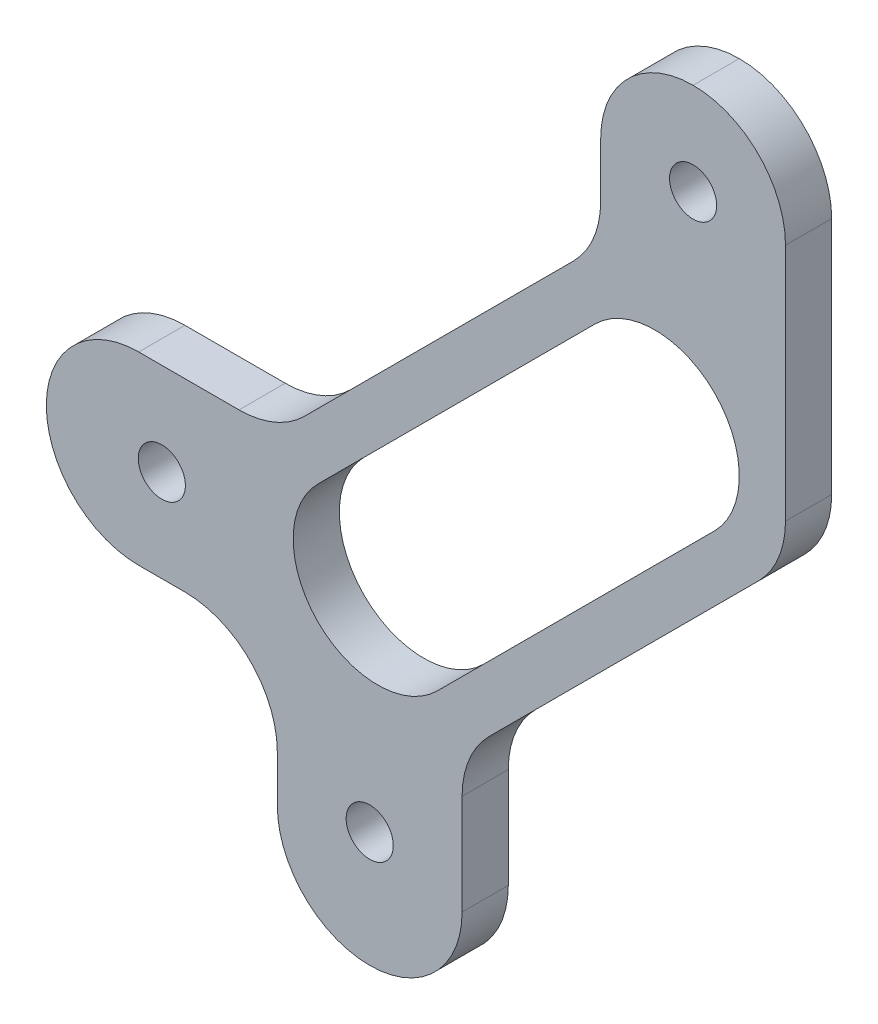
ISO-10303-21;
HEADER;
FILE_DESCRIPTION(('STEP AP214'),'2;1');
FILE_NAME('part.step','',(''),(''),'','','');
FILE_SCHEMA(('AUTOMOTIVE_DESIGN { 1 0 10303 214 1 1 1 1 }'));
ENDSEC;
DATA;
#1=APPLICATION_CONTEXT('core data for automotive mechanical design processes');
#2=APPLICATION_PROTOCOL_DEFINITION('international standard','automotive_design',2000,#1);
#3=PRODUCT_CONTEXT('',#1,'mechanical');
#4=PRODUCT('Part','Part','',(#3));
#5=PRODUCT_RELATED_PRODUCT_CATEGORY('part','',(#4));
#6=PRODUCT_DEFINITION_FORMATION('','',#4);
#7=PRODUCT_DEFINITION_CONTEXT('part definition',#1,'design');
#8=PRODUCT_DEFINITION('design','',#6,#7);
#9=PRODUCT_DEFINITION_SHAPE('','',#8);
#10=(LENGTH_UNIT() NAMED_UNIT(*) SI_UNIT(.MILLI.,.METRE.));
#11=(NAMED_UNIT(*) PLANE_ANGLE_UNIT() SI_UNIT($,.RADIAN.));
#12=(NAMED_UNIT(*) SI_UNIT($,.STERADIAN.) SOLID_ANGLE_UNIT());
#13=UNCERTAINTY_MEASURE_WITH_UNIT(LENGTH_MEASURE(1.E-05),#10,'distance_accuracy_value','');
#14=(GEOMETRIC_REPRESENTATION_CONTEXT(3) GLOBAL_UNCERTAINTY_ASSIGNED_CONTEXT((#13)) GLOBAL_UNIT_ASSIGNED_CONTEXT((#10,
#11,#12)) REPRESENTATION_CONTEXT('',''));
#15=CARTESIAN_POINT('',(0.,0.,0.));
#16=DIRECTION('',(0.,0.,1.));
#17=DIRECTION('',(1.,0.,0.));
#18=AXIS2_PLACEMENT_3D('',#15,#16,#17);
#19=CARTESIAN_POINT('',(0.,0.,5.));
#20=DIRECTION('',(0.,0.,-1.));
#21=DIRECTION('',(-1.,0.,0.));
#22=AXIS2_PLACEMENT_3D('',#19,#20,#21);
#23=PLANE('',#22);
#24=DIRECTION('',(0.707106781186547,0.707106781186547,0.));
#25=VECTOR('',#24,1.);
#26=CARTESIAN_POINT('',(47.3223304703363,34.3933982822018,5.));
#27=LINE('',#26,#25);
#28=CARTESIAN_POINT('',(17.3223304703363,4.39339828220181,5.));
#29=VERTEX_POINT('',#28);
#30=CARTESIAN_POINT('',(47.3223304703363,34.3933982822018,5.));
#31=VERTEX_POINT('',#30);
#32=EDGE_CURVE('E230',#29,#31,#27,.T.);
#33=ORIENTED_EDGE('',*,*,#32,.F.);
#34=CARTESIAN_POINT('',(10.8578643762691,10.8578643762691,5.));
#35=DIRECTION('',(0.,0.,1.));
#36=DIRECTION('',(1.,0.,0.));
#37=AXIS2_PLACEMENT_3D('',#34,#35,#36);
#38=CIRCLE('',#37,9.14213562373093);
#39=CARTESIAN_POINT('',(4.39339828220181,17.3223304703363,5.));
#40=VERTEX_POINT('',#39);
#41=EDGE_CURVE('E57',#40,#29,#38,.T.);
#42=ORIENTED_EDGE('',*,*,#41,.F.);
#43=DIRECTION('',(-0.707106781186547,-0.707106781186548,0.));
#44=VECTOR('',#43,1.);
#45=CARTESIAN_POINT('',(4.39339828220181,17.3223304703363,5.));
#46=LINE('',#45,#44);
#47=CARTESIAN_POINT('',(34.3933982822018,47.3223304703363,5.));
#48=VERTEX_POINT('',#47);
#49=EDGE_CURVE('E217',#48,#40,#46,.T.);
#50=ORIENTED_EDGE('',*,*,#49,.F.);
#51=CARTESIAN_POINT('',(40.8578643762691,40.8578643762691,5.));
#52=DIRECTION('',(0.,0.,1.));
#53=DIRECTION('',(1.,0.,0.));
#54=AXIS2_PLACEMENT_3D('',#51,#52,#53);
#55=CIRCLE('',#54,9.14213562373094);
#56=EDGE_CURVE('E221',#31,#48,#55,.T.);
#57=ORIENTED_EDGE('',*,*,#56,.F.);
#58=EDGE_LOOP('',(#33,#42,#50,#57));
#59=FACE_BOUND('',#58,.T.);
#60=CARTESIAN_POINT('',(45.,65.,5.));
#61=DIRECTION('',(0.,0.,-1.));
#62=DIRECTION('',(-1.,0.,0.));
#63=AXIS2_PLACEMENT_3D('',#60,#61,#62);
#64=CIRCLE('',#63,10.);
#65=CARTESIAN_POINT('',(55.,65.,5.));
#66=VERTEX_POINT('',#65);
#67=CARTESIAN_POINT('',(45.,75.,5.));
#68=VERTEX_POINT('',#67);
#69=EDGE_CURVE('E376',#66,#68,#64,.F.);
#70=ORIENTED_EDGE('',*,*,#69,.T.);
#71=CARTESIAN_POINT('',(45.,65.,5.));
#72=DIRECTION('',(0.,0.,-1.));
#73=DIRECTION('',(-1.,0.,0.));
#74=AXIS2_PLACEMENT_3D('',#71,#72,#73);
#75=CIRCLE('',#74,10.);
#76=CARTESIAN_POINT('',(35.,65.,5.));
#77=VERTEX_POINT('',#76);
#78=EDGE_CURVE('E379',#68,#77,#75,.F.);
#79=ORIENTED_EDGE('',*,*,#78,.T.);
#80=DIRECTION('',(0.,-1.,0.));
#81=VECTOR('',#80,1.);
#82=CARTESIAN_POINT('',(35.,55.,5.));
#83=LINE('',#82,#81);
#84=CARTESIAN_POINT('',(35.,59.1421356237309,5.));
#85=VERTEX_POINT('',#84);
#86=EDGE_CURVE('E283',#77,#85,#83,.T.);
#87=ORIENTED_EDGE('',*,*,#86,.T.);
#88=CARTESIAN_POINT('',(25.,59.1421356237309,5.));
#89=DIRECTION('',(0.,0.,-1.));
#90=DIRECTION('',(-1.,0.,0.));
#91=AXIS2_PLACEMENT_3D('',#88,#89,#90);
#92=CIRCLE('',#91,10.);
#93=CARTESIAN_POINT('',(32.0710678118655,52.0710678118655,5.));
#94=VERTEX_POINT('',#93);
#95=EDGE_CURVE('E11',#85,#94,#92,.T.);
#96=ORIENTED_EDGE('',*,*,#95,.T.);
#97=DIRECTION('',(-0.707106781186546,-0.707106781186549,0.));
#98=VECTOR('',#97,1.);
#99=CARTESIAN_POINT('',(1.56125112837913E-13,20.,5.));
#100=LINE('',#99,#98);
#101=CARTESIAN_POINT('',(2.92893218813469,22.9289321881345,5.));
#102=VERTEX_POINT('',#101);
#103=EDGE_CURVE('E287',#94,#102,#100,.T.);
#104=ORIENTED_EDGE('',*,*,#103,.T.);
#105=CARTESIAN_POINT('',(-4.1421356237308,30.,5.));
#106=DIRECTION('',(0.,0.,-1.));
#107=DIRECTION('',(-1.,0.,0.));
#108=AXIS2_PLACEMENT_3D('',#105,#106,#107);
#109=CIRCLE('',#108,10.);
#110=CARTESIAN_POINT('',(-4.1421356237308,20.,5.));
#111=VERTEX_POINT('',#110);
#112=EDGE_CURVE('E446',#102,#111,#109,.T.);
#113=ORIENTED_EDGE('',*,*,#112,.T.);
#114=DIRECTION('',(-1.,0.,0.));
#115=VECTOR('',#114,1.);
#116=CARTESIAN_POINT('',(-25.,20.,5.));
#117=LINE('',#116,#115);
#118=CARTESIAN_POINT('',(-15.,20.,5.));
#119=VERTEX_POINT('',#118);
#120=EDGE_CURVE('E291',#111,#119,#117,.T.);
#121=ORIENTED_EDGE('',*,*,#120,.T.);
#122=CARTESIAN_POINT('',(-15.,10.,5.));
#123=DIRECTION('',(0.,0.,-1.));
#124=DIRECTION('',(-1.,0.,0.));
#125=AXIS2_PLACEMENT_3D('',#122,#123,#124);
#126=CIRCLE('',#125,10.);
#127=CARTESIAN_POINT('',(-25.,10.,5.));
#128=VERTEX_POINT('',#127);
#129=EDGE_CURVE('E364',#119,#128,#126,.F.);
#130=ORIENTED_EDGE('',*,*,#129,.T.);
#131=CARTESIAN_POINT('',(-15.,10.,5.));
#132=DIRECTION('',(0.,0.,-1.));
#133=DIRECTION('',(-1.,0.,0.));
#134=AXIS2_PLACEMENT_3D('',#131,#132,#133);
#135=CIRCLE('',#134,10.);
#136=CARTESIAN_POINT('',(-15.,0.,5.));
#137=VERTEX_POINT('',#136);
#138=EDGE_CURVE('E367',#128,#137,#135,.F.);
#139=ORIENTED_EDGE('',*,*,#138,.T.);
#140=DIRECTION('',(1.,0.,0.));
#141=VECTOR('',#140,1.);
#142=CARTESIAN_POINT('',(0.,0.,5.));
#143=LINE('',#142,#141);
#144=CARTESIAN_POINT('',(-10.,0.,5.));
#145=VERTEX_POINT('',#144);
#146=EDGE_CURVE('E295',#137,#145,#143,.T.);
#147=ORIENTED_EDGE('',*,*,#146,.T.);
#148=CARTESIAN_POINT('',(-10.,-10.,5.));
#149=DIRECTION('',(0.,0.,-1.));
#150=DIRECTION('',(-1.,0.,0.));
#151=AXIS2_PLACEMENT_3D('',#148,#149,#150);
#152=CIRCLE('',#151,10.);
#153=CARTESIAN_POINT('',(0.,-10.,5.));
#154=VERTEX_POINT('',#153);
#155=EDGE_CURVE('E440',#145,#154,#152,.T.);
#156=ORIENTED_EDGE('',*,*,#155,.T.);
#157=DIRECTION('',(0.,-1.,0.));
#158=VECTOR('',#157,1.);
#159=CARTESIAN_POINT('',(0.,-25.,5.));
#160=LINE('',#159,#158);
#161=CARTESIAN_POINT('',(0.,-15.,5.));
#162=VERTEX_POINT('',#161);
#163=EDGE_CURVE('E299',#154,#162,#160,.T.);
#164=ORIENTED_EDGE('',*,*,#163,.T.);
#165=CARTESIAN_POINT('',(10.,-15.,5.));
#166=DIRECTION('',(0.,0.,-1.));
#167=DIRECTION('',(-1.,0.,0.));
#168=AXIS2_PLACEMENT_3D('',#165,#166,#167);
#169=CIRCLE('',#168,10.);
#170=CARTESIAN_POINT('',(10.,-25.,5.));
#171=VERTEX_POINT('',#170);
#172=EDGE_CURVE('E370',#162,#171,#169,.F.);
#173=ORIENTED_EDGE('',*,*,#172,.T.);
#174=CARTESIAN_POINT('',(10.,-15.,5.));
#175=DIRECTION('',(0.,0.,-1.));
#176=DIRECTION('',(-1.,0.,0.));
#177=AXIS2_PLACEMENT_3D('',#174,#175,#176);
#178=CIRCLE('',#177,10.);
#179=CARTESIAN_POINT('',(20.,-15.,5.));
#180=VERTEX_POINT('',#179);
#181=EDGE_CURVE('E373',#171,#180,#178,.F.);
#182=ORIENTED_EDGE('',*,*,#181,.T.);
#183=DIRECTION('',(0.,1.,0.));
#184=VECTOR('',#183,1.);
#185=CARTESIAN_POINT('',(20.,0.,5.));
#186=LINE('',#185,#184);
#187=CARTESIAN_POINT('',(20.,-4.14213562373095,5.));
#188=VERTEX_POINT('',#187);
#189=EDGE_CURVE('E270',#180,#188,#186,.T.);
#190=ORIENTED_EDGE('',*,*,#189,.T.);
#191=CARTESIAN_POINT('',(30.,-4.14213562373094,5.));
#192=DIRECTION('',(0.,0.,-1.));
#193=DIRECTION('',(-1.,0.,0.));
#194=AXIS2_PLACEMENT_3D('',#191,#192,#193);
#195=CIRCLE('',#194,10.);
#196=CARTESIAN_POINT('',(22.9289321881345,2.92893218813452,5.));
#197=VERTEX_POINT('',#196);
#198=EDGE_CURVE('E434',#188,#197,#195,.T.);
#199=ORIENTED_EDGE('',*,*,#198,.T.);
#200=DIRECTION('',(0.707106781186546,0.707106781186549,0.));
#201=VECTOR('',#200,1.);
#202=CARTESIAN_POINT('',(55.,35.0000000000002,5.));
#203=LINE('',#202,#201);
#204=CARTESIAN_POINT('',(52.0710678118655,32.0710678118656,5.));
#205=VERTEX_POINT('',#204);
#206=EDGE_CURVE('E274',#197,#205,#203,.T.);
#207=ORIENTED_EDGE('',*,*,#206,.T.);
#208=CARTESIAN_POINT('',(45.,39.1421356237311,5.));
#209=DIRECTION('',(0.,0.,-1.));
#210=DIRECTION('',(-1.,0.,0.));
#211=AXIS2_PLACEMENT_3D('',#208,#209,#210);
#212=CIRCLE('',#211,10.);
#213=CARTESIAN_POINT('',(55.,39.1421356237311,5.));
#214=VERTEX_POINT('',#213);
#215=EDGE_CURVE('E361',#205,#214,#212,.F.);
#216=ORIENTED_EDGE('',*,*,#215,.T.);
#217=DIRECTION('',(0.,1.,0.));
#218=VECTOR('',#217,1.);
#219=CARTESIAN_POINT('',(55.,75.,5.));
#220=LINE('',#219,#218);
#221=EDGE_CURVE('E279',#214,#66,#220,.T.);
#222=ORIENTED_EDGE('',*,*,#221,.T.);
#223=EDGE_LOOP('',(#70,#79,#87,#96,#104,#113,#121,#130,#139,#147,#156,#164,#173,#182,#190,#199,
#207,#216,#222));
#224=FACE_BOUND('',#223,.T.);
#225=CARTESIAN_POINT('',(-12.5,10.,5.));
#226=DIRECTION('',(0.,0.,1.));
#227=DIRECTION('',(1.,0.,0.));
#228=AXIS2_PLACEMENT_3D('',#225,#226,#227);
#229=CIRCLE('',#228,2.55);
#230=CARTESIAN_POINT('',(-9.95,10.,5.));
#231=VERTEX_POINT('',#230);
#232=EDGE_CURVE('E262',#231,#231,#229,.T.);
#233=ORIENTED_EDGE('',*,*,#232,.F.);
#234=EDGE_LOOP('',(#233));
#235=FACE_BOUND('',#234,.T.);
#236=CARTESIAN_POINT('',(10.,-12.5,5.));
#237=DIRECTION('',(0.,0.,1.));
#238=DIRECTION('',(1.,0.,0.));
#239=AXIS2_PLACEMENT_3D('',#236,#237,#238);
#240=CIRCLE('',#239,2.55);
#241=CARTESIAN_POINT('',(12.55,-12.5,5.));
#242=VERTEX_POINT('',#241);
#243=EDGE_CURVE('E254',#242,#242,#240,.T.);
#244=ORIENTED_EDGE('',*,*,#243,.F.);
#245=EDGE_LOOP('',(#244));
#246=FACE_BOUND('',#245,.T.);
#247=CARTESIAN_POINT('',(45.,65.,5.));
#248=DIRECTION('',(0.,0.,1.));
#249=DIRECTION('',(1.,0.,0.));
#250=AXIS2_PLACEMENT_3D('',#247,#248,#249);
#251=CIRCLE('',#250,2.55);
#252=CARTESIAN_POINT('',(47.55,65.,5.));
#253=VERTEX_POINT('',#252);
#254=EDGE_CURVE('E244',#253,#253,#251,.T.);
#255=ORIENTED_EDGE('',*,*,#254,.F.);
#256=EDGE_LOOP('',(#255));
#257=FACE_BOUND('',#256,.T.);
#258=ADVANCED_FACE('F39',(#59,#224,#235,#246,#257),#23,.F.);
#259=CARTESIAN_POINT('',(0.,0.,0.));
#260=DIRECTION('',(0.,0.,-1.));
#261=DIRECTION('',(-1.,0.,0.));
#262=AXIS2_PLACEMENT_3D('',#259,#260,#261);
#263=PLANE('',#262);
#264=CARTESIAN_POINT('',(10.8578643762691,10.8578643762691,0.));
#265=DIRECTION('',(0.,0.,1.));
#266=DIRECTION('',(1.,0.,0.));
#267=AXIS2_PLACEMENT_3D('',#264,#265,#266);
#268=CIRCLE('',#267,9.14213562373093);
#269=CARTESIAN_POINT('',(4.39339828220181,17.3223304703363,0.));
#270=VERTEX_POINT('',#269);
#271=CARTESIAN_POINT('',(17.3223304703363,4.39339828220181,0.));
#272=VERTEX_POINT('',#271);
#273=EDGE_CURVE('E198',#270,#272,#268,.T.);
#274=ORIENTED_EDGE('',*,*,#273,.T.);
#275=DIRECTION('',(0.707106781186547,0.707106781186547,0.));
#276=VECTOR('',#275,1.);
#277=CARTESIAN_POINT('',(47.3223304703363,34.3933982822018,0.));
#278=LINE('',#277,#276);
#279=CARTESIAN_POINT('',(47.3223304703363,34.3933982822018,0.));
#280=VERTEX_POINT('',#279);
#281=EDGE_CURVE('E208',#272,#280,#278,.T.);
#282=ORIENTED_EDGE('',*,*,#281,.T.);
#283=CARTESIAN_POINT('',(40.8578643762691,40.8578643762691,0.));
#284=DIRECTION('',(0.,0.,1.));
#285=DIRECTION('',(1.,0.,0.));
#286=AXIS2_PLACEMENT_3D('',#283,#284,#285);
#287=CIRCLE('',#286,9.14213562373094);
#288=CARTESIAN_POINT('',(34.3933982822018,47.3223304703363,0.));
#289=VERTEX_POINT('',#288);
#290=EDGE_CURVE('E65',#280,#289,#287,.T.);
#291=ORIENTED_EDGE('',*,*,#290,.T.);
#292=DIRECTION('',(-0.707106781186547,-0.707106781186548,0.));
#293=VECTOR('',#292,1.);
#294=CARTESIAN_POINT('',(4.39339828220181,17.3223304703363,0.));
#295=LINE('',#294,#293);
#296=EDGE_CURVE('E205',#289,#270,#295,.T.);
#297=ORIENTED_EDGE('',*,*,#296,.T.);
#298=EDGE_LOOP('',(#274,#282,#291,#297));
#299=FACE_BOUND('',#298,.T.);
#300=CARTESIAN_POINT('',(10.,-12.5,0.));
#301=DIRECTION('',(0.,0.,1.));
#302=DIRECTION('',(1.,0.,0.));
#303=AXIS2_PLACEMENT_3D('',#300,#301,#302);
#304=CIRCLE('',#303,2.55);
#305=CARTESIAN_POINT('',(12.55,-12.5,0.));
#306=VERTEX_POINT('',#305);
#307=EDGE_CURVE('E248',#306,#306,#304,.T.);
#308=ORIENTED_EDGE('',*,*,#307,.T.);
#309=EDGE_LOOP('',(#308));
#310=FACE_BOUND('',#309,.T.);
#311=DIRECTION('',(0.,-1.,0.));
#312=VECTOR('',#311,1.);
#313=CARTESIAN_POINT('',(35.,55.,0.));
#314=LINE('',#313,#312);
#315=CARTESIAN_POINT('',(35.,65.,0.));
#316=VERTEX_POINT('',#315);
#317=CARTESIAN_POINT('',(35.,59.1421356237309,0.));
#318=VERTEX_POINT('',#317);
#319=EDGE_CURVE('E315',#316,#318,#314,.T.);
#320=ORIENTED_EDGE('',*,*,#319,.F.);
#321=CARTESIAN_POINT('',(45.,65.,0.));
#322=DIRECTION('',(0.,0.,-1.));
#323=DIRECTION('',(-1.,0.,0.));
#324=AXIS2_PLACEMENT_3D('',#321,#322,#323);
#325=CIRCLE('',#324,10.);
#326=CARTESIAN_POINT('',(45.,75.,0.));
#327=VERTEX_POINT('',#326);
#328=EDGE_CURVE('E358',#316,#327,#325,.T.);
#329=ORIENTED_EDGE('',*,*,#328,.T.);
#330=CARTESIAN_POINT('',(45.,65.,0.));
#331=DIRECTION('',(0.,0.,-1.));
#332=DIRECTION('',(-1.,0.,0.));
#333=AXIS2_PLACEMENT_3D('',#330,#331,#332);
#334=CIRCLE('',#333,10.);
#335=CARTESIAN_POINT('',(55.,65.,0.));
#336=VERTEX_POINT('',#335);
#337=EDGE_CURVE('E355',#327,#336,#334,.T.);
#338=ORIENTED_EDGE('',*,*,#337,.T.);
#339=DIRECTION('',(0.,1.,0.));
#340=VECTOR('',#339,1.);
#341=CARTESIAN_POINT('',(55.,75.,0.));
#342=LINE('',#341,#340);
#343=CARTESIAN_POINT('',(55.,39.1421356237311,0.));
#344=VERTEX_POINT('',#343);
#345=EDGE_CURVE('E311',#344,#336,#342,.T.);
#346=ORIENTED_EDGE('',*,*,#345,.F.);
#347=CARTESIAN_POINT('',(45.,39.1421356237311,0.));
#348=DIRECTION('',(0.,0.,-1.));
#349=DIRECTION('',(-1.,0.,0.));
#350=AXIS2_PLACEMENT_3D('',#347,#348,#349);
#351=CIRCLE('',#350,10.);
#352=CARTESIAN_POINT('',(52.0710678118655,32.0710678118656,0.));
#353=VERTEX_POINT('',#352);
#354=EDGE_CURVE('E340',#344,#353,#351,.T.);
#355=ORIENTED_EDGE('',*,*,#354,.T.);
#356=DIRECTION('',(0.707106781186546,0.707106781186549,0.));
#357=VECTOR('',#356,1.);
#358=CARTESIAN_POINT('',(55.,35.0000000000002,0.));
#359=LINE('',#358,#357);
#360=CARTESIAN_POINT('',(22.9289321881345,2.92893218813452,0.));
#361=VERTEX_POINT('',#360);
#362=EDGE_CURVE('E307',#361,#353,#359,.T.);
#363=ORIENTED_EDGE('',*,*,#362,.F.);
#364=CARTESIAN_POINT('',(30.,-4.14213562373094,0.));
#365=DIRECTION('',(0.,0.,-1.));
#366=DIRECTION('',(-1.,0.,0.));
#367=AXIS2_PLACEMENT_3D('',#364,#365,#366);
#368=CIRCLE('',#367,10.);
#369=CARTESIAN_POINT('',(20.,-4.14213562373095,0.));
#370=VERTEX_POINT('',#369);
#371=EDGE_CURVE('E431',#361,#370,#368,.F.);
#372=ORIENTED_EDGE('',*,*,#371,.T.);
#373=DIRECTION('',(0.,1.,0.));
#374=VECTOR('',#373,1.);
#375=CARTESIAN_POINT('',(20.,0.,0.));
#376=LINE('',#375,#374);
#377=CARTESIAN_POINT('',(20.,-15.,0.));
#378=VERTEX_POINT('',#377);
#379=EDGE_CURVE('E266',#378,#370,#376,.T.);
#380=ORIENTED_EDGE('',*,*,#379,.F.);
#381=CARTESIAN_POINT('',(10.,-15.,0.));
#382=DIRECTION('',(0.,0.,-1.));
#383=DIRECTION('',(-1.,0.,0.));
#384=AXIS2_PLACEMENT_3D('',#381,#382,#383);
#385=CIRCLE('',#384,10.);
#386=CARTESIAN_POINT('',(10.,-25.,0.));
#387=VERTEX_POINT('',#386);
#388=EDGE_CURVE('E352',#378,#387,#385,.T.);
#389=ORIENTED_EDGE('',*,*,#388,.T.);
#390=CARTESIAN_POINT('',(10.,-15.,0.));
#391=DIRECTION('',(0.,0.,-1.));
#392=DIRECTION('',(-1.,0.,0.));
#393=AXIS2_PLACEMENT_3D('',#390,#391,#392);
#394=CIRCLE('',#393,10.);
#395=CARTESIAN_POINT('',(0.,-15.,0.));
#396=VERTEX_POINT('',#395);
#397=EDGE_CURVE('E349',#387,#396,#394,.T.);
#398=ORIENTED_EDGE('',*,*,#397,.T.);
#399=DIRECTION('',(0.,-1.,0.));
#400=VECTOR('',#399,1.);
#401=CARTESIAN_POINT('',(0.,-25.,0.));
#402=LINE('',#401,#400);
#403=CARTESIAN_POINT('',(0.,-10.,0.));
#404=VERTEX_POINT('',#403);
#405=EDGE_CURVE('E275',#404,#396,#402,.T.);
#406=ORIENTED_EDGE('',*,*,#405,.F.);
#407=CARTESIAN_POINT('',(-10.,-10.,0.));
#408=DIRECTION('',(0.,0.,-1.));
#409=DIRECTION('',(-1.,0.,0.));
#410=AXIS2_PLACEMENT_3D('',#407,#408,#409);
#411=CIRCLE('',#410,10.);
#412=CARTESIAN_POINT('',(-10.,0.,0.));
#413=VERTEX_POINT('',#412);
#414=EDGE_CURVE('E437',#404,#413,#411,.F.);
#415=ORIENTED_EDGE('',*,*,#414,.T.);
#416=DIRECTION('',(1.,0.,0.));
#417=VECTOR('',#416,1.);
#418=CARTESIAN_POINT('',(0.,0.,0.));
#419=LINE('',#418,#417);
#420=CARTESIAN_POINT('',(-15.,0.,0.));
#421=VERTEX_POINT('',#420);
#422=EDGE_CURVE('E327',#421,#413,#419,.T.);
#423=ORIENTED_EDGE('',*,*,#422,.F.);
#424=CARTESIAN_POINT('',(-15.,10.,0.));
#425=DIRECTION('',(0.,0.,-1.));
#426=DIRECTION('',(-1.,0.,0.));
#427=AXIS2_PLACEMENT_3D('',#424,#425,#426);
#428=CIRCLE('',#427,10.);
#429=CARTESIAN_POINT('',(-25.,10.,0.));
#430=VERTEX_POINT('',#429);
#431=EDGE_CURVE('E346',#421,#430,#428,.T.);
#432=ORIENTED_EDGE('',*,*,#431,.T.);
#433=CARTESIAN_POINT('',(-15.,10.,0.));
#434=DIRECTION('',(0.,0.,-1.));
#435=DIRECTION('',(-1.,0.,0.));
#436=AXIS2_PLACEMENT_3D('',#433,#434,#435);
#437=CIRCLE('',#436,10.);
#438=CARTESIAN_POINT('',(-15.,20.,0.));
#439=VERTEX_POINT('',#438);
#440=EDGE_CURVE('E343',#430,#439,#437,.T.);
#441=ORIENTED_EDGE('',*,*,#440,.T.);
#442=DIRECTION('',(-1.,0.,0.));
#443=VECTOR('',#442,1.);
#444=CARTESIAN_POINT('',(-25.,20.,0.));
#445=LINE('',#444,#443);
#446=CARTESIAN_POINT('',(-4.1421356237308,20.,0.));
#447=VERTEX_POINT('',#446);
#448=EDGE_CURVE('E323',#447,#439,#445,.T.);
#449=ORIENTED_EDGE('',*,*,#448,.F.);
#450=CARTESIAN_POINT('',(-4.1421356237308,30.,0.));
#451=DIRECTION('',(0.,0.,-1.));
#452=DIRECTION('',(-1.,0.,0.));
#453=AXIS2_PLACEMENT_3D('',#450,#451,#452);
#454=CIRCLE('',#453,10.);
#455=CARTESIAN_POINT('',(2.92893218813469,22.9289321881345,0.));
#456=VERTEX_POINT('',#455);
#457=EDGE_CURVE('E443',#447,#456,#454,.F.);
#458=ORIENTED_EDGE('',*,*,#457,.T.);
#459=DIRECTION('',(-0.707106781186546,-0.707106781186549,0.));
#460=VECTOR('',#459,1.);
#461=CARTESIAN_POINT('',(1.56125112837913E-13,20.,0.));
#462=LINE('',#461,#460);
#463=CARTESIAN_POINT('',(32.0710678118655,52.0710678118655,0.));
#464=VERTEX_POINT('',#463);
#465=EDGE_CURVE('E319',#464,#456,#462,.T.);
#466=ORIENTED_EDGE('',*,*,#465,.F.);
#467=CARTESIAN_POINT('',(25.,59.1421356237309,0.));
#468=DIRECTION('',(0.,0.,-1.));
#469=DIRECTION('',(-1.,0.,0.));
#470=AXIS2_PLACEMENT_3D('',#467,#468,#469);
#471=CIRCLE('',#470,10.);
#472=EDGE_CURVE('E49',#464,#318,#471,.F.);
#473=ORIENTED_EDGE('',*,*,#472,.T.);
#474=EDGE_LOOP('',(#320,#329,#338,#346,#355,#363,#372,#380,#389,#398,#406,#415,#423,#432,#441,
#449,#458,#466,#473));
#475=FACE_BOUND('',#474,.T.);
#476=CARTESIAN_POINT('',(-12.5,10.,0.));
#477=DIRECTION('',(0.,0.,1.));
#478=DIRECTION('',(1.,0.,0.));
#479=AXIS2_PLACEMENT_3D('',#476,#477,#478);
#480=CIRCLE('',#479,2.55);
#481=CARTESIAN_POINT('',(-9.95,10.,0.));
#482=VERTEX_POINT('',#481);
#483=EDGE_CURVE('E258',#482,#482,#480,.T.);
#484=ORIENTED_EDGE('',*,*,#483,.T.);
#485=EDGE_LOOP('',(#484));
#486=FACE_BOUND('',#485,.T.);
#487=CARTESIAN_POINT('',(45.,65.,0.));
#488=DIRECTION('',(0.,0.,1.));
#489=DIRECTION('',(1.,0.,0.));
#490=AXIS2_PLACEMENT_3D('',#487,#488,#489);
#491=CIRCLE('',#490,2.55);
#492=CARTESIAN_POINT('',(47.55,65.,0.));
#493=VERTEX_POINT('',#492);
#494=EDGE_CURVE('E249',#493,#493,#491,.T.);
#495=ORIENTED_EDGE('',*,*,#494,.T.);
#496=EDGE_LOOP('',(#495));
#497=FACE_BOUND('',#496,.T.);
#498=ADVANCED_FACE('F213',(#299,#310,#475,#486,#497),#263,.T.);
#499=CARTESIAN_POINT('',(20.,0.,5.));
#500=DIRECTION('',(-1.,0.,0.));
#501=DIRECTION('',(0.,-1.,0.));
#502=AXIS2_PLACEMENT_3D('',#499,#500,#501);
#503=PLANE('',#502);
#504=ORIENTED_EDGE('',*,*,#379,.T.);
#505=DIRECTION('',(0.,0.,-1.));
#506=VECTOR('',#505,1.);
#507=CARTESIAN_POINT('',(20.,-4.14213562373095,5.));
#508=LINE('',#507,#506);
#509=EDGE_CURVE('E400',#370,#188,#508,.F.);
#510=ORIENTED_EDGE('',*,*,#509,.T.);
#511=ORIENTED_EDGE('',*,*,#189,.F.);
#512=DIRECTION('',(0.,0.,-1.));
#513=VECTOR('',#512,1.);
#514=CARTESIAN_POINT('',(20.,-15.,5.));
#515=LINE('',#514,#513);
#516=EDGE_CURVE('E396',#180,#378,#515,.T.);
#517=ORIENTED_EDGE('',*,*,#516,.T.);
#518=EDGE_LOOP('',(#504,#510,#511,#517));
#519=FACE_BOUND('',#518,.T.);
#520=ADVANCED_FACE('F527',(#519),#503,.F.);
#521=CARTESIAN_POINT('',(55.,35.0000000000002,5.));
#522=DIRECTION('',(-0.707106781186549,0.707106781186546,0.));
#523=DIRECTION('',(-0.707106781186546,-0.707106781186549,0.));
#524=AXIS2_PLACEMENT_3D('',#521,#522,#523);
#525=PLANE('',#524);
#526=ORIENTED_EDGE('',*,*,#206,.F.);
#527=DIRECTION('',(0.,0.,-1.));
#528=VECTOR('',#527,1.);
#529=CARTESIAN_POINT('',(22.9289321881345,2.92893218813452,0.));
#530=LINE('',#529,#528);
#531=EDGE_CURVE('E392',#197,#361,#530,.T.);
#532=ORIENTED_EDGE('',*,*,#531,.T.);
#533=ORIENTED_EDGE('',*,*,#362,.T.);
#534=DIRECTION('',(0.,0.,-1.));
#535=VECTOR('',#534,1.);
#536=CARTESIAN_POINT('',(52.0710678118655,32.0710678118656,5.));
#537=LINE('',#536,#535);
#538=EDGE_CURVE('E389',#353,#205,#537,.F.);
#539=ORIENTED_EDGE('',*,*,#538,.T.);
#540=EDGE_LOOP('',(#526,#532,#533,#539));
#541=FACE_BOUND('',#540,.T.);
#542=ADVANCED_FACE('F519',(#541),#525,.F.);
#543=CARTESIAN_POINT('',(55.,75.,5.));
#544=DIRECTION('',(-1.,0.,0.));
#545=DIRECTION('',(0.,-1.,0.));
#546=AXIS2_PLACEMENT_3D('',#543,#544,#545);
#547=PLANE('',#546);
#548=ORIENTED_EDGE('',*,*,#345,.T.);
#549=DIRECTION('',(0.,0.,-1.));
#550=VECTOR('',#549,1.);
#551=CARTESIAN_POINT('',(55.,65.,5.));
#552=LINE('',#551,#550);
#553=EDGE_CURVE('E386',#336,#66,#552,.F.);
#554=ORIENTED_EDGE('',*,*,#553,.T.);
#555=ORIENTED_EDGE('',*,*,#221,.F.);
#556=DIRECTION('',(0.,0.,-1.));
#557=VECTOR('',#556,1.);
#558=CARTESIAN_POINT('',(55.,39.1421356237311,5.));
#559=LINE('',#558,#557);
#560=EDGE_CURVE('E382',#214,#344,#559,.T.);
#561=ORIENTED_EDGE('',*,*,#560,.T.);
#562=EDGE_LOOP('',(#548,#554,#555,#561));
#563=FACE_BOUND('',#562,.T.);
#564=ADVANCED_FACE('F509',(#563),#547,.F.);
#565=CARTESIAN_POINT('',(35.,55.,5.));
#566=DIRECTION('',(1.,0.,0.));
#567=DIRECTION('',(0.,0.,-1.));
#568=AXIS2_PLACEMENT_3D('',#565,#566,#567);
#569=PLANE('',#568);
#570=ORIENTED_EDGE('',*,*,#86,.F.);
#571=DIRECTION('',(0.,0.,-1.));
#572=VECTOR('',#571,1.);
#573=CARTESIAN_POINT('',(35.,65.,5.));
#574=LINE('',#573,#572);
#575=EDGE_CURVE('E336',#77,#316,#574,.T.);
#576=ORIENTED_EDGE('',*,*,#575,.T.);
#577=ORIENTED_EDGE('',*,*,#319,.T.);
#578=DIRECTION('',(0.,0.,-1.));
#579=VECTOR('',#578,1.);
#580=CARTESIAN_POINT('',(35.,59.1421356237309,5.));
#581=LINE('',#580,#579);
#582=EDGE_CURVE('E303',#318,#85,#581,.F.);
#583=ORIENTED_EDGE('',*,*,#582,.T.);
#584=EDGE_LOOP('',(#570,#576,#577,#583));
#585=FACE_BOUND('',#584,.T.);
#586=ADVANCED_FACE('F495',(#585),#569,.F.);
#587=CARTESIAN_POINT('',(1.56125112837913E-13,20.,5.));
#588=DIRECTION('',(0.707106781186549,-0.707106781186546,0.));
#589=DIRECTION('',(0.707106781186546,0.707106781186549,0.));
#590=AXIS2_PLACEMENT_3D('',#587,#588,#589);
#591=PLANE('',#590);
#592=ORIENTED_EDGE('',*,*,#465,.T.);
#593=DIRECTION('',(0.,0.,-1.));
#594=VECTOR('',#593,1.);
#595=CARTESIAN_POINT('',(2.92893218813469,22.9289321881345,5.));
#596=LINE('',#595,#594);
#597=EDGE_CURVE('E428',#456,#102,#596,.F.);
#598=ORIENTED_EDGE('',*,*,#597,.T.);
#599=ORIENTED_EDGE('',*,*,#103,.F.);
#600=DIRECTION('',(0.,0.,-1.));
#601=VECTOR('',#600,1.);
#602=CARTESIAN_POINT('',(32.0710678118655,52.0710678118655,0.));
#603=LINE('',#602,#601);
#604=EDGE_CURVE('E424',#94,#464,#603,.T.);
#605=ORIENTED_EDGE('',*,*,#604,.T.);
#606=EDGE_LOOP('',(#592,#598,#599,#605));
#607=FACE_BOUND('',#606,.T.);
#608=ADVANCED_FACE('F486',(#607),#591,.F.);
#609=CARTESIAN_POINT('',(-25.,20.,5.));
#610=DIRECTION('',(0.,-1.,0.));
#611=DIRECTION('',(1.,0.,0.));
#612=AXIS2_PLACEMENT_3D('',#609,#610,#611);
#613=PLANE('',#612);
#614=ORIENTED_EDGE('',*,*,#448,.T.);
#615=DIRECTION('',(0.,0.,-1.));
#616=VECTOR('',#615,1.);
#617=CARTESIAN_POINT('',(-15.,20.,5.));
#618=LINE('',#617,#616);
#619=EDGE_CURVE('E421',#439,#119,#618,.F.);
#620=ORIENTED_EDGE('',*,*,#619,.T.);
#621=ORIENTED_EDGE('',*,*,#120,.F.);
#622=DIRECTION('',(0.,0.,-1.));
#623=VECTOR('',#622,1.);
#624=CARTESIAN_POINT('',(-4.1421356237308,20.,0.));
#625=LINE('',#624,#623);
#626=EDGE_CURVE('E417',#111,#447,#625,.T.);
#627=ORIENTED_EDGE('',*,*,#626,.T.);
#628=EDGE_LOOP('',(#614,#620,#621,#627));
#629=FACE_BOUND('',#628,.T.);
#630=ADVANCED_FACE('F477',(#629),#613,.F.);
#631=CARTESIAN_POINT('',(0.,0.,5.));
#632=DIRECTION('',(0.,1.,0.));
#633=DIRECTION('',(0.,0.,1.));
#634=AXIS2_PLACEMENT_3D('',#631,#632,#633);
#635=PLANE('',#634);
#636=ORIENTED_EDGE('',*,*,#422,.T.);
#637=DIRECTION('',(0.,0.,-1.));
#638=VECTOR('',#637,1.);
#639=CARTESIAN_POINT('',(-10.,0.,5.));
#640=LINE('',#639,#638);
#641=EDGE_CURVE('E414',#413,#145,#640,.F.);
#642=ORIENTED_EDGE('',*,*,#641,.T.);
#643=ORIENTED_EDGE('',*,*,#146,.F.);
#644=DIRECTION('',(0.,0.,-1.));
#645=VECTOR('',#644,1.);
#646=CARTESIAN_POINT('',(-15.,0.,5.));
#647=LINE('',#646,#645);
#648=EDGE_CURVE('E410',#137,#421,#647,.T.);
#649=ORIENTED_EDGE('',*,*,#648,.T.);
#650=EDGE_LOOP('',(#636,#642,#643,#649));
#651=FACE_BOUND('',#650,.T.);
#652=ADVANCED_FACE('F547',(#651),#635,.F.);
#653=CARTESIAN_POINT('',(0.,-25.,5.));
#654=DIRECTION('',(1.,0.,0.));
#655=DIRECTION('',(0.,0.,-1.));
#656=AXIS2_PLACEMENT_3D('',#653,#654,#655);
#657=PLANE('',#656);
#658=ORIENTED_EDGE('',*,*,#405,.T.);
#659=DIRECTION('',(0.,0.,-1.));
#660=VECTOR('',#659,1.);
#661=CARTESIAN_POINT('',(0.,-15.,5.));
#662=LINE('',#661,#660);
#663=EDGE_CURVE('E407',#396,#162,#662,.F.);
#664=ORIENTED_EDGE('',*,*,#663,.T.);
#665=ORIENTED_EDGE('',*,*,#163,.F.);
#666=DIRECTION('',(0.,0.,-1.));
#667=VECTOR('',#666,1.);
#668=CARTESIAN_POINT('',(0.,-10.,0.));
#669=LINE('',#668,#667);
#670=EDGE_CURVE('E403',#154,#404,#669,.T.);
#671=ORIENTED_EDGE('',*,*,#670,.T.);
#672=EDGE_LOOP('',(#658,#664,#665,#671));
#673=FACE_BOUND('',#672,.T.);
#674=ADVANCED_FACE('F539',(#673),#657,.F.);
#675=CARTESIAN_POINT('',(-12.5,10.,5.));
#676=DIRECTION('',(0.,0.,-1.));
#677=DIRECTION('',(-1.,0.,0.));
#678=AXIS2_PLACEMENT_3D('',#675,#676,#677);
#679=CYLINDRICAL_SURFACE('',#678,2.55);
#680=ORIENTED_EDGE('',*,*,#232,.T.);
#681=EDGE_LOOP('',(#680));
#682=FACE_BOUND('',#681,.T.);
#683=ORIENTED_EDGE('',*,*,#483,.F.);
#684=EDGE_LOOP('',(#683));
#685=FACE_BOUND('',#684,.T.);
#686=ADVANCED_FACE('F554',(#682,#685),#679,.F.);
#687=CARTESIAN_POINT('',(10.,-12.5,5.));
#688=DIRECTION('',(0.,0.,-1.));
#689=DIRECTION('',(-1.,0.,0.));
#690=AXIS2_PLACEMENT_3D('',#687,#688,#689);
#691=CYLINDRICAL_SURFACE('',#690,2.55);
#692=ORIENTED_EDGE('',*,*,#243,.T.);
#693=EDGE_LOOP('',(#692));
#694=FACE_BOUND('',#693,.T.);
#695=ORIENTED_EDGE('',*,*,#307,.F.);
#696=EDGE_LOOP('',(#695));
#697=FACE_BOUND('',#696,.T.);
#698=ADVANCED_FACE('F567',(#694,#697),#691,.F.);
#699=CARTESIAN_POINT('',(45.,65.,5.));
#700=DIRECTION('',(0.,0.,-1.));
#701=DIRECTION('',(-1.,0.,0.));
#702=AXIS2_PLACEMENT_3D('',#699,#700,#701);
#703=CYLINDRICAL_SURFACE('',#702,2.55);
#704=ORIENTED_EDGE('',*,*,#254,.T.);
#705=EDGE_LOOP('',(#704));
#706=FACE_BOUND('',#705,.T.);
#707=ORIENTED_EDGE('',*,*,#494,.F.);
#708=EDGE_LOOP('',(#707));
#709=FACE_BOUND('',#708,.T.);
#710=ADVANCED_FACE('F571',(#706,#709),#703,.F.);
#711=CARTESIAN_POINT('',(45.,65.,5.));
#712=DIRECTION('',(0.,0.,-1.));
#713=DIRECTION('',(-1.,0.,0.));
#714=AXIS2_PLACEMENT_3D('',#711,#712,#713);
#715=CYLINDRICAL_SURFACE('',#714,10.);
#716=DIRECTION('',(0.,0.,-1.));
#717=VECTOR('',#716,1.);
#718=CARTESIAN_POINT('',(45.,75.,5.));
#719=LINE('',#718,#717);
#720=EDGE_CURVE('E253',#68,#327,#719,.T.);
#721=ORIENTED_EDGE('',*,*,#720,.F.);
#722=ORIENTED_EDGE('',*,*,#69,.F.);
#723=ORIENTED_EDGE('',*,*,#553,.F.);
#724=ORIENTED_EDGE('',*,*,#337,.F.);
#725=EDGE_LOOP('',(#721,#722,#723,#724));
#726=FACE_BOUND('',#725,.T.);
#727=ADVANCED_FACE('F505',(#726),#715,.T.);
#728=CARTESIAN_POINT('',(45.,65.,5.));
#729=DIRECTION('',(0.,0.,-1.));
#730=DIRECTION('',(-1.,0.,0.));
#731=AXIS2_PLACEMENT_3D('',#728,#729,#730);
#732=CYLINDRICAL_SURFACE('',#731,10.);
#733=ORIENTED_EDGE('',*,*,#78,.F.);
#734=ORIENTED_EDGE('',*,*,#720,.T.);
#735=ORIENTED_EDGE('',*,*,#328,.F.);
#736=ORIENTED_EDGE('',*,*,#575,.F.);
#737=EDGE_LOOP('',(#733,#734,#735,#736));
#738=FACE_BOUND('',#737,.T.);
#739=ADVANCED_FACE('F499',(#738),#732,.T.);
#740=CARTESIAN_POINT('',(30.,-4.14213562373094,5.));
#741=DIRECTION('',(0.,0.,1.));
#742=DIRECTION('',(1.,0.,0.));
#743=AXIS2_PLACEMENT_3D('',#740,#741,#742);
#744=CYLINDRICAL_SURFACE('',#743,10.);
#745=ORIENTED_EDGE('',*,*,#198,.F.);
#746=ORIENTED_EDGE('',*,*,#509,.F.);
#747=ORIENTED_EDGE('',*,*,#371,.F.);
#748=ORIENTED_EDGE('',*,*,#531,.F.);
#749=EDGE_LOOP('',(#745,#746,#747,#748));
#750=FACE_BOUND('',#749,.T.);
#751=ADVANCED_FACE('F523',(#750),#744,.F.);
#752=CARTESIAN_POINT('',(10.,-15.,5.));
#753=DIRECTION('',(0.,0.,-1.));
#754=DIRECTION('',(-1.,0.,0.));
#755=AXIS2_PLACEMENT_3D('',#752,#753,#754);
#756=CYLINDRICAL_SURFACE('',#755,10.);
#757=DIRECTION('',(0.,0.,-1.));
#758=VECTOR('',#757,1.);
#759=CARTESIAN_POINT('',(10.,-25.,5.));
#760=LINE('',#759,#758);
#761=EDGE_CURVE('E453',#171,#387,#760,.T.);
#762=ORIENTED_EDGE('',*,*,#761,.F.);
#763=ORIENTED_EDGE('',*,*,#172,.F.);
#764=ORIENTED_EDGE('',*,*,#663,.F.);
#765=ORIENTED_EDGE('',*,*,#397,.F.);
#766=EDGE_LOOP('',(#762,#763,#764,#765));
#767=FACE_BOUND('',#766,.T.);
#768=ADVANCED_FACE('F535',(#767),#756,.T.);
#769=CARTESIAN_POINT('',(10.,-15.,5.));
#770=DIRECTION('',(0.,0.,-1.));
#771=DIRECTION('',(-1.,0.,0.));
#772=AXIS2_PLACEMENT_3D('',#769,#770,#771);
#773=CYLINDRICAL_SURFACE('',#772,10.);
#774=ORIENTED_EDGE('',*,*,#181,.F.);
#775=ORIENTED_EDGE('',*,*,#761,.T.);
#776=ORIENTED_EDGE('',*,*,#388,.F.);
#777=ORIENTED_EDGE('',*,*,#516,.F.);
#778=EDGE_LOOP('',(#774,#775,#776,#777));
#779=FACE_BOUND('',#778,.T.);
#780=ADVANCED_FACE('F530',(#779),#773,.T.);
#781=CARTESIAN_POINT('',(-10.,-10.,5.));
#782=DIRECTION('',(0.,0.,1.));
#783=DIRECTION('',(1.,0.,0.));
#784=AXIS2_PLACEMENT_3D('',#781,#782,#783);
#785=CYLINDRICAL_SURFACE('',#784,10.);
#786=ORIENTED_EDGE('',*,*,#155,.F.);
#787=ORIENTED_EDGE('',*,*,#641,.F.);
#788=ORIENTED_EDGE('',*,*,#414,.F.);
#789=ORIENTED_EDGE('',*,*,#670,.F.);
#790=EDGE_LOOP('',(#786,#787,#788,#789));
#791=FACE_BOUND('',#790,.T.);
#792=ADVANCED_FACE('F545',(#791),#785,.F.);
#793=CARTESIAN_POINT('',(-15.,10.,5.));
#794=DIRECTION('',(0.,0.,-1.));
#795=DIRECTION('',(-1.,0.,0.));
#796=AXIS2_PLACEMENT_3D('',#793,#794,#795);
#797=CYLINDRICAL_SURFACE('',#796,10.);
#798=DIRECTION('',(0.,0.,-1.));
#799=VECTOR('',#798,1.);
#800=CARTESIAN_POINT('',(-25.,10.,5.));
#801=LINE('',#800,#799);
#802=EDGE_CURVE('E43',#128,#430,#801,.T.);
#803=ORIENTED_EDGE('',*,*,#802,.F.);
#804=ORIENTED_EDGE('',*,*,#129,.F.);
#805=ORIENTED_EDGE('',*,*,#619,.F.);
#806=ORIENTED_EDGE('',*,*,#440,.F.);
#807=EDGE_LOOP('',(#803,#804,#805,#806));
#808=FACE_BOUND('',#807,.T.);
#809=ADVANCED_FACE('F469',(#808),#797,.T.);
#810=CARTESIAN_POINT('',(-15.,10.,5.));
#811=DIRECTION('',(0.,0.,-1.));
#812=DIRECTION('',(-1.,0.,0.));
#813=AXIS2_PLACEMENT_3D('',#810,#811,#812);
#814=CYLINDRICAL_SURFACE('',#813,10.);
#815=ORIENTED_EDGE('',*,*,#138,.F.);
#816=ORIENTED_EDGE('',*,*,#802,.T.);
#817=ORIENTED_EDGE('',*,*,#431,.F.);
#818=ORIENTED_EDGE('',*,*,#648,.F.);
#819=EDGE_LOOP('',(#815,#816,#817,#818));
#820=FACE_BOUND('',#819,.T.);
#821=ADVANCED_FACE('F464',(#820),#814,.T.);
#822=CARTESIAN_POINT('',(-4.1421356237308,30.,5.));
#823=DIRECTION('',(0.,0.,1.));
#824=DIRECTION('',(1.,0.,0.));
#825=AXIS2_PLACEMENT_3D('',#822,#823,#824);
#826=CYLINDRICAL_SURFACE('',#825,10.);
#827=ORIENTED_EDGE('',*,*,#112,.F.);
#828=ORIENTED_EDGE('',*,*,#597,.F.);
#829=ORIENTED_EDGE('',*,*,#457,.F.);
#830=ORIENTED_EDGE('',*,*,#626,.F.);
#831=EDGE_LOOP('',(#827,#828,#829,#830));
#832=FACE_BOUND('',#831,.T.);
#833=ADVANCED_FACE('F482',(#832),#826,.F.);
#834=CARTESIAN_POINT('',(25.,59.1421356237309,5.));
#835=DIRECTION('',(0.,0.,1.));
#836=DIRECTION('',(1.,0.,0.));
#837=AXIS2_PLACEMENT_3D('',#834,#835,#836);
#838=CYLINDRICAL_SURFACE('',#837,10.);
#839=ORIENTED_EDGE('',*,*,#95,.F.);
#840=ORIENTED_EDGE('',*,*,#582,.F.);
#841=ORIENTED_EDGE('',*,*,#472,.F.);
#842=ORIENTED_EDGE('',*,*,#604,.F.);
#843=EDGE_LOOP('',(#839,#840,#841,#842));
#844=FACE_BOUND('',#843,.T.);
#845=ADVANCED_FACE('F491',(#844),#838,.F.);
#846=CARTESIAN_POINT('',(45.,39.1421356237311,5.));
#847=DIRECTION('',(0.,0.,-1.));
#848=DIRECTION('',(-1.,0.,0.));
#849=AXIS2_PLACEMENT_3D('',#846,#847,#848);
#850=CYLINDRICAL_SURFACE('',#849,10.);
#851=ORIENTED_EDGE('',*,*,#215,.F.);
#852=ORIENTED_EDGE('',*,*,#538,.F.);
#853=ORIENTED_EDGE('',*,*,#354,.F.);
#854=ORIENTED_EDGE('',*,*,#560,.F.);
#855=EDGE_LOOP('',(#851,#852,#853,#854));
#856=FACE_BOUND('',#855,.T.);
#857=ADVANCED_FACE('F41',(#856),#850,.T.);
#858=CARTESIAN_POINT('',(10.8578643762691,10.8578643762691,0.));
#859=DIRECTION('',(0.,0.,1.));
#860=DIRECTION('',(1.,0.,0.));
#861=AXIS2_PLACEMENT_3D('',#858,#859,#860);
#862=CYLINDRICAL_SURFACE('',#861,9.14213562373093);
#863=ORIENTED_EDGE('',*,*,#41,.T.);
#864=DIRECTION('',(0.,0.,1.));
#865=VECTOR('',#864,1.);
#866=CARTESIAN_POINT('',(17.3223304703363,4.39339828220181,0.));
#867=LINE('',#866,#865);
#868=EDGE_CURVE('E194',#272,#29,#867,.T.);
#869=ORIENTED_EDGE('',*,*,#868,.F.);
#870=ORIENTED_EDGE('',*,*,#273,.F.);
#871=DIRECTION('',(0.,0.,1.));
#872=VECTOR('',#871,1.);
#873=CARTESIAN_POINT('',(4.39339828220181,17.3223304703363,0.));
#874=LINE('',#873,#872);
#875=EDGE_CURVE('E236',#270,#40,#874,.T.);
#876=ORIENTED_EDGE('',*,*,#875,.T.);
#877=EDGE_LOOP('',(#863,#869,#870,#876));
#878=FACE_BOUND('',#877,.T.);
#879=ADVANCED_FACE('F196',(#878),#862,.F.);
#880=CARTESIAN_POINT('',(4.39339828220181,17.3223304703363,0.));
#881=DIRECTION('',(-0.707106781186548,0.707106781186547,0.));
#882=DIRECTION('',(-0.707106781186547,-0.707106781186548,0.));
#883=AXIS2_PLACEMENT_3D('',#880,#881,#882);
#884=PLANE('',#883);
#885=ORIENTED_EDGE('',*,*,#49,.T.);
#886=ORIENTED_EDGE('',*,*,#875,.F.);
#887=ORIENTED_EDGE('',*,*,#296,.F.);
#888=DIRECTION('',(0.,0.,1.));
#889=VECTOR('',#888,1.);
#890=CARTESIAN_POINT('',(34.3933982822018,47.3223304703363,0.));
#891=LINE('',#890,#889);
#892=EDGE_CURVE('E239',#289,#48,#891,.T.);
#893=ORIENTED_EDGE('',*,*,#892,.T.);
#894=EDGE_LOOP('',(#885,#886,#887,#893));
#895=FACE_BOUND('',#894,.T.);
#896=ADVANCED_FACE('F578',(#895),#884,.F.);
#897=CARTESIAN_POINT('',(40.8578643762691,40.8578643762691,0.));
#898=DIRECTION('',(0.,0.,1.));
#899=DIRECTION('',(1.,0.,0.));
#900=AXIS2_PLACEMENT_3D('',#897,#898,#899);
#901=CYLINDRICAL_SURFACE('',#900,9.14213562373094);
#902=ORIENTED_EDGE('',*,*,#56,.T.);
#903=ORIENTED_EDGE('',*,*,#892,.F.);
#904=ORIENTED_EDGE('',*,*,#290,.F.);
#905=DIRECTION('',(0.,0.,1.));
#906=VECTOR('',#905,1.);
#907=CARTESIAN_POINT('',(47.3223304703363,34.3933982822018,0.));
#908=LINE('',#907,#906);
#909=EDGE_CURVE('E204',#280,#31,#908,.T.);
#910=ORIENTED_EDGE('',*,*,#909,.T.);
#911=EDGE_LOOP('',(#902,#903,#904,#910));
#912=FACE_BOUND('',#911,.T.);
#913=ADVANCED_FACE('F581',(#912),#901,.F.);
#914=CARTESIAN_POINT('',(47.3223304703363,34.3933982822018,0.));
#915=DIRECTION('',(0.707106781186548,-0.707106781186548,0.));
#916=DIRECTION('',(0.707106781186548,0.707106781186548,0.));
#917=AXIS2_PLACEMENT_3D('',#914,#915,#916);
#918=PLANE('',#917);
#919=ORIENTED_EDGE('',*,*,#32,.T.);
#920=ORIENTED_EDGE('',*,*,#909,.F.);
#921=ORIENTED_EDGE('',*,*,#281,.F.);
#922=ORIENTED_EDGE('',*,*,#868,.T.);
#923=EDGE_LOOP('',(#919,#920,#921,#922));
#924=FACE_BOUND('',#923,.T.);
#925=ADVANCED_FACE('F209',(#924),#918,.F.);
#926=CLOSED_SHELL('',(#258,#498,#520,#542,#564,#586,#608,#630,#652,#674,#686,#698,#710,#727,
#739,#751,#768,#780,#792,#809,#821,#833,#845,#857,#879,#896,#913,#925));
#927=MANIFOLD_SOLID_BREP('B2',#926);
#928=ADVANCED_BREP_SHAPE_REPRESENTATION('',(#18,#927),#14);
#929=SHAPE_DEFINITION_REPRESENTATION(#9,#928);
ENDSEC;
END-ISO-10303-21;
